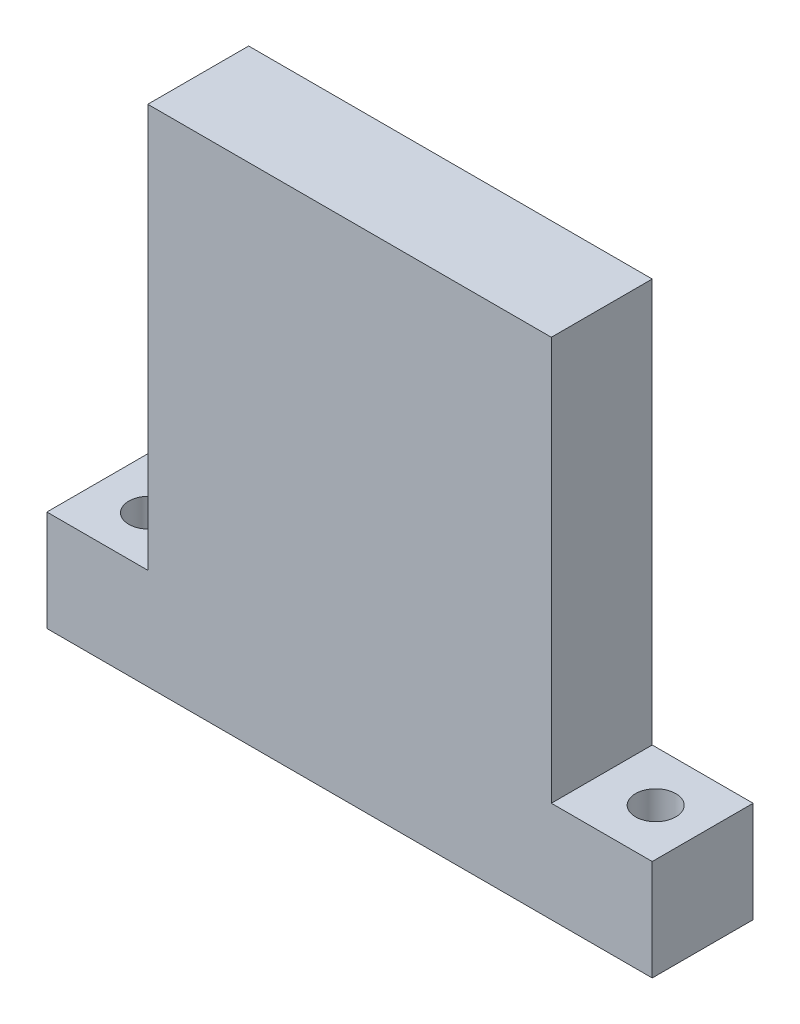
ISO-10303-21;
HEADER;
FILE_DESCRIPTION(('STEP AP214'),'2;1');
FILE_NAME('part.step','',(''),(''),'','','');
FILE_SCHEMA(('AUTOMOTIVE_DESIGN { 1 0 10303 214 1 1 1 1 }'));
ENDSEC;
DATA;
#1=APPLICATION_CONTEXT('core data for automotive mechanical design processes');
#2=APPLICATION_PROTOCOL_DEFINITION('international standard','automotive_design',2000,#1);
#3=PRODUCT_CONTEXT('',#1,'mechanical');
#4=PRODUCT('Part','Part','',(#3));
#5=PRODUCT_RELATED_PRODUCT_CATEGORY('part','',(#4));
#6=PRODUCT_DEFINITION_FORMATION('','',#4);
#7=PRODUCT_DEFINITION_CONTEXT('part definition',#1,'design');
#8=PRODUCT_DEFINITION('design','',#6,#7);
#9=PRODUCT_DEFINITION_SHAPE('','',#8);
#10=(LENGTH_UNIT() NAMED_UNIT(*) SI_UNIT(.MILLI.,.METRE.));
#11=(NAMED_UNIT(*) PLANE_ANGLE_UNIT() SI_UNIT($,.RADIAN.));
#12=(NAMED_UNIT(*) SI_UNIT($,.STERADIAN.) SOLID_ANGLE_UNIT());
#13=UNCERTAINTY_MEASURE_WITH_UNIT(LENGTH_MEASURE(1.E-05),#10,'distance_accuracy_value','');
#14=(GEOMETRIC_REPRESENTATION_CONTEXT(3) GLOBAL_UNCERTAINTY_ASSIGNED_CONTEXT((#13)) GLOBAL_UNIT_ASSIGNED_CONTEXT((#10,
#11,#12)) REPRESENTATION_CONTEXT('',''));
#15=CARTESIAN_POINT('',(0.,0.,0.));
#16=DIRECTION('',(0.,0.,1.));
#17=DIRECTION('',(1.,0.,0.));
#18=AXIS2_PLACEMENT_3D('',#15,#16,#17);
#19=CARTESIAN_POINT('',(0.,10.,0.));
#20=DIRECTION('',(0.,1.,0.));
#21=DIRECTION('',(0.,0.,1.));
#22=AXIS2_PLACEMENT_3D('',#19,#20,#21);
#23=PLANE('',#22);
#24=CARTESIAN_POINT('',(25.342956813367,10.,0.));
#25=DIRECTION('',(0.,1.,0.));
#26=DIRECTION('',(0.,0.,1.));
#27=AXIS2_PLACEMENT_3D('',#24,#25,#26);
#28=CIRCLE('',#27,2.);
#29=CARTESIAN_POINT('',(25.342956813367,9.99999999999999,2.));
#30=VERTEX_POINT('',#29);
#31=EDGE_CURVE('E169',#30,#30,#28,.T.);
#32=ORIENTED_EDGE('',*,*,#31,.F.);
#33=EDGE_LOOP('',(#32));
#34=FACE_BOUND('',#33,.T.);
#35=DIRECTION('',(0.,0.,-1.));
#36=VECTOR('',#35,1.);
#37=CARTESIAN_POINT('',(20.,10.,-5.));
#38=LINE('',#37,#36);
#39=CARTESIAN_POINT('',(20.,10.,5.));
#40=VERTEX_POINT('',#39);
#41=CARTESIAN_POINT('',(20.,10.,-5.));
#42=VERTEX_POINT('',#41);
#43=EDGE_CURVE('E52',#40,#42,#38,.T.);
#44=ORIENTED_EDGE('',*,*,#43,.F.);
#45=DIRECTION('',(1.,0.,0.));
#46=VECTOR('',#45,1.);
#47=CARTESIAN_POINT('',(-30.,10.,5.));
#48=LINE('',#47,#46);
#49=CARTESIAN_POINT('',(30.,10.,5.));
#50=VERTEX_POINT('',#49);
#51=EDGE_CURVE('E141',#40,#50,#48,.T.);
#52=ORIENTED_EDGE('',*,*,#51,.T.);
#53=DIRECTION('',(0.,0.,-1.));
#54=VECTOR('',#53,1.);
#55=CARTESIAN_POINT('',(30.,10.,-5.));
#56=LINE('',#55,#54);
#57=CARTESIAN_POINT('',(30.,10.,-5.));
#58=VERTEX_POINT('',#57);
#59=EDGE_CURVE('E132',#50,#58,#56,.T.);
#60=ORIENTED_EDGE('',*,*,#59,.T.);
#61=DIRECTION('',(-1.,0.,0.));
#62=VECTOR('',#61,1.);
#63=CARTESIAN_POINT('',(-30.,10.,-5.));
#64=LINE('',#63,#62);
#65=EDGE_CURVE('E137',#58,#42,#64,.T.);
#66=ORIENTED_EDGE('',*,*,#65,.T.);
#67=EDGE_LOOP('',(#44,#52,#60,#66));
#68=FACE_BOUND('',#67,.T.);
#69=ADVANCED_FACE('F35',(#34,#68),#23,.T.);
#70=CARTESIAN_POINT('',(30.,10.,-5.));
#71=DIRECTION('',(-1.,0.,0.));
#72=DIRECTION('',(0.,0.,1.));
#73=AXIS2_PLACEMENT_3D('',#70,#71,#72);
#74=PLANE('',#73);
#75=DIRECTION('',(0.,0.,-1.));
#76=VECTOR('',#75,1.);
#77=CARTESIAN_POINT('',(30.,0.,-5.));
#78=LINE('',#77,#76);
#79=CARTESIAN_POINT('',(30.,0.,5.));
#80=VERTEX_POINT('',#79);
#81=CARTESIAN_POINT('',(30.,0.,-5.));
#82=VERTEX_POINT('',#81);
#83=EDGE_CURVE('E123',#80,#82,#78,.T.);
#84=ORIENTED_EDGE('',*,*,#83,.T.);
#85=DIRECTION('',(0.,-1.,0.));
#86=VECTOR('',#85,1.);
#87=CARTESIAN_POINT('',(30.,10.,-5.));
#88=LINE('',#87,#86);
#89=EDGE_CURVE('E11',#58,#82,#88,.T.);
#90=ORIENTED_EDGE('',*,*,#89,.F.);
#91=ORIENTED_EDGE('',*,*,#59,.F.);
#92=DIRECTION('',(0.,-1.,0.));
#93=VECTOR('',#92,1.);
#94=CARTESIAN_POINT('',(30.,10.,5.));
#95=LINE('',#94,#93);
#96=EDGE_CURVE('E143',#50,#80,#95,.T.);
#97=ORIENTED_EDGE('',*,*,#96,.T.);
#98=EDGE_LOOP('',(#84,#90,#91,#97));
#99=FACE_BOUND('',#98,.T.);
#100=ADVANCED_FACE('F37',(#99),#74,.F.);
#101=CARTESIAN_POINT('',(-30.,10.,-5.));
#102=DIRECTION('',(0.,0.,1.));
#103=DIRECTION('',(1.,0.,0.));
#104=AXIS2_PLACEMENT_3D('',#101,#102,#103);
#105=PLANE('',#104);
#106=CARTESIAN_POINT('',(0.,30.,-5.));
#107=DIRECTION('',(0.,0.,-1.));
#108=DIRECTION('',(-1.,0.,0.));
#109=AXIS2_PLACEMENT_3D('',#106,#107,#108);
#110=CIRCLE('',#109,11.);
#111=CARTESIAN_POINT('',(-11.,30.,-5.));
#112=VERTEX_POINT('',#111);
#113=EDGE_CURVE('E157',#112,#112,#110,.T.);
#114=ORIENTED_EDGE('',*,*,#113,.F.);
#115=EDGE_LOOP('',(#114));
#116=FACE_BOUND('',#115,.T.);
#117=DIRECTION('',(-1.,0.,0.));
#118=VECTOR('',#117,1.);
#119=CARTESIAN_POINT('',(-30.,0.,-5.));
#120=LINE('',#119,#118);
#121=CARTESIAN_POINT('',(-30.,0.,-5.));
#122=VERTEX_POINT('',#121);
#123=EDGE_CURVE('E126',#82,#122,#120,.T.);
#124=ORIENTED_EDGE('',*,*,#123,.T.);
#125=DIRECTION('',(0.,-1.,0.));
#126=VECTOR('',#125,1.);
#127=CARTESIAN_POINT('',(-30.,10.,-5.));
#128=LINE('',#127,#126);
#129=CARTESIAN_POINT('',(-30.,10.,-5.));
#130=VERTEX_POINT('',#129);
#131=EDGE_CURVE('E44',#130,#122,#128,.T.);
#132=ORIENTED_EDGE('',*,*,#131,.F.);
#133=CARTESIAN_POINT('',(-20.,10.,-5.));
#134=VERTEX_POINT('',#133);
#135=EDGE_CURVE('E135',#134,#130,#64,.T.);
#136=ORIENTED_EDGE('',*,*,#135,.F.);
#137=DIRECTION('',(0.,-1.,0.));
#138=VECTOR('',#137,1.);
#139=CARTESIAN_POINT('',(-20.,50.,-5.));
#140=LINE('',#139,#138);
#141=CARTESIAN_POINT('',(-20.,50.,-5.));
#142=VERTEX_POINT('',#141);
#143=EDGE_CURVE('E108',#142,#134,#140,.T.);
#144=ORIENTED_EDGE('',*,*,#143,.F.);
#145=DIRECTION('',(-1.,0.,0.));
#146=VECTOR('',#145,1.);
#147=CARTESIAN_POINT('',(-20.,50.,-5.));
#148=LINE('',#147,#146);
#149=CARTESIAN_POINT('',(20.,50.,-5.));
#150=VERTEX_POINT('',#149);
#151=EDGE_CURVE('E102',#150,#142,#148,.T.);
#152=ORIENTED_EDGE('',*,*,#151,.F.);
#153=DIRECTION('',(0.,-1.,0.));
#154=VECTOR('',#153,1.);
#155=CARTESIAN_POINT('',(20.,50.,-5.));
#156=LINE('',#155,#154);
#157=EDGE_CURVE('E106',#150,#42,#156,.T.);
#158=ORIENTED_EDGE('',*,*,#157,.T.);
#159=ORIENTED_EDGE('',*,*,#65,.F.);
#160=ORIENTED_EDGE('',*,*,#89,.T.);
#161=EDGE_LOOP('',(#124,#132,#136,#144,#152,#158,#159,#160));
#162=FACE_BOUND('',#161,.T.);
#163=ADVANCED_FACE('F104',(#116,#162),#105,.F.);
#164=CARTESIAN_POINT('',(-30.,10.,-5.));
#165=DIRECTION('',(1.,0.,0.));
#166=DIRECTION('',(0.,0.,-1.));
#167=AXIS2_PLACEMENT_3D('',#164,#165,#166);
#168=PLANE('',#167);
#169=DIRECTION('',(0.,0.,1.));
#170=VECTOR('',#169,1.);
#171=CARTESIAN_POINT('',(-30.,0.,-5.));
#172=LINE('',#171,#170);
#173=CARTESIAN_POINT('',(-30.,0.,5.));
#174=VERTEX_POINT('',#173);
#175=EDGE_CURVE('E146',#122,#174,#172,.T.);
#176=ORIENTED_EDGE('',*,*,#175,.T.);
#177=DIRECTION('',(0.,-1.,0.));
#178=VECTOR('',#177,1.);
#179=CARTESIAN_POINT('',(-30.,10.,5.));
#180=LINE('',#179,#178);
#181=CARTESIAN_POINT('',(-30.,10.,5.));
#182=VERTEX_POINT('',#181);
#183=EDGE_CURVE('E151',#182,#174,#180,.T.);
#184=ORIENTED_EDGE('',*,*,#183,.F.);
#185=DIRECTION('',(0.,0.,1.));
#186=VECTOR('',#185,1.);
#187=CARTESIAN_POINT('',(-30.,10.,-5.));
#188=LINE('',#187,#186);
#189=EDGE_CURVE('E139',#130,#182,#188,.T.);
#190=ORIENTED_EDGE('',*,*,#189,.F.);
#191=ORIENTED_EDGE('',*,*,#131,.T.);
#192=EDGE_LOOP('',(#176,#184,#190,#191));
#193=FACE_BOUND('',#192,.T.);
#194=ADVANCED_FACE('F213',(#193),#168,.F.);
#195=CARTESIAN_POINT('',(-30.,10.,5.));
#196=DIRECTION('',(0.,0.,-1.));
#197=DIRECTION('',(-1.,0.,0.));
#198=AXIS2_PLACEMENT_3D('',#195,#196,#197);
#199=PLANE('',#198);
#200=DIRECTION('',(1.,0.,0.));
#201=VECTOR('',#200,1.);
#202=CARTESIAN_POINT('',(-30.,0.,5.));
#203=LINE('',#202,#201);
#204=EDGE_CURVE('E136',#174,#80,#203,.T.);
#205=ORIENTED_EDGE('',*,*,#204,.T.);
#206=ORIENTED_EDGE('',*,*,#96,.F.);
#207=ORIENTED_EDGE('',*,*,#51,.F.);
#208=DIRECTION('',(0.,-1.,0.));
#209=VECTOR('',#208,1.);
#210=CARTESIAN_POINT('',(20.,50.,5.));
#211=LINE('',#210,#209);
#212=CARTESIAN_POINT('',(20.,50.,5.));
#213=VERTEX_POINT('',#212);
#214=EDGE_CURVE('E176',#213,#40,#211,.T.);
#215=ORIENTED_EDGE('',*,*,#214,.F.);
#216=DIRECTION('',(1.,0.,0.));
#217=VECTOR('',#216,1.);
#218=CARTESIAN_POINT('',(-20.,50.,5.));
#219=LINE('',#218,#217);
#220=CARTESIAN_POINT('',(-20.,50.,5.));
#221=VERTEX_POINT('',#220);
#222=EDGE_CURVE('E117',#221,#213,#219,.T.);
#223=ORIENTED_EDGE('',*,*,#222,.F.);
#224=DIRECTION('',(0.,-1.,0.));
#225=VECTOR('',#224,1.);
#226=CARTESIAN_POINT('',(-20.,50.,5.));
#227=LINE('',#226,#225);
#228=CARTESIAN_POINT('',(-20.,10.,5.));
#229=VERTEX_POINT('',#228);
#230=EDGE_CURVE('E128',#221,#229,#227,.T.);
#231=ORIENTED_EDGE('',*,*,#230,.T.);
#232=EDGE_CURVE('E142',#182,#229,#48,.T.);
#233=ORIENTED_EDGE('',*,*,#232,.F.);
#234=ORIENTED_EDGE('',*,*,#183,.T.);
#235=EDGE_LOOP('',(#205,#206,#207,#215,#223,#231,#233,#234));
#236=FACE_BOUND('',#235,.T.);
#237=ADVANCED_FACE('F183',(#236),#199,.F.);
#238=CARTESIAN_POINT('',(-24.8796636726594,10.,0.));
#239=DIRECTION('',(0.,1.,0.));
#240=DIRECTION('',(0.,0.,1.));
#241=AXIS2_PLACEMENT_3D('',#238,#239,#240);
#242=CIRCLE('',#241,2.);
#243=CARTESIAN_POINT('',(-24.8796636726594,9.99999999999999,2.));
#244=VERTEX_POINT('',#243);
#245=EDGE_CURVE('E158',#244,#244,#242,.T.);
#246=ORIENTED_EDGE('',*,*,#245,.F.);
#247=EDGE_LOOP('',(#246));
#248=FACE_BOUND('',#247,.T.);
#249=DIRECTION('',(0.,0.,1.));
#250=VECTOR('',#249,1.);
#251=CARTESIAN_POINT('',(-20.,10.,-5.));
#252=LINE('',#251,#250);
#253=EDGE_CURVE('E60',#134,#229,#252,.T.);
#254=ORIENTED_EDGE('',*,*,#253,.F.);
#255=ORIENTED_EDGE('',*,*,#135,.T.);
#256=ORIENTED_EDGE('',*,*,#189,.T.);
#257=ORIENTED_EDGE('',*,*,#232,.T.);
#258=EDGE_LOOP('',(#254,#255,#256,#257));
#259=FACE_BOUND('',#258,.T.);
#260=ADVANCED_FACE('F199',(#248,#259),#23,.T.);
#261=CARTESIAN_POINT('',(0.,0.,0.));
#262=DIRECTION('',(0.,1.,0.));
#263=DIRECTION('',(0.,0.,1.));
#264=AXIS2_PLACEMENT_3D('',#261,#262,#263);
#265=PLANE('',#264);
#266=CARTESIAN_POINT('',(25.342956813367,0.,0.));
#267=DIRECTION('',(0.,1.,0.));
#268=DIRECTION('',(0.,0.,1.));
#269=AXIS2_PLACEMENT_3D('',#266,#267,#268);
#270=CIRCLE('',#269,2.);
#271=CARTESIAN_POINT('',(25.342956813367,0.,2.));
#272=VERTEX_POINT('',#271);
#273=EDGE_CURVE('E39',#272,#272,#270,.T.);
#274=ORIENTED_EDGE('',*,*,#273,.T.);
#275=EDGE_LOOP('',(#274));
#276=FACE_BOUND('',#275,.T.);
#277=CARTESIAN_POINT('',(-24.8796636726594,0.,0.));
#278=DIRECTION('',(0.,1.,0.));
#279=DIRECTION('',(0.,0.,1.));
#280=AXIS2_PLACEMENT_3D('',#277,#278,#279);
#281=CIRCLE('',#280,2.);
#282=CARTESIAN_POINT('',(-24.8796636726594,0.,2.));
#283=VERTEX_POINT('',#282);
#284=EDGE_CURVE('E155',#283,#283,#281,.T.);
#285=ORIENTED_EDGE('',*,*,#284,.T.);
#286=EDGE_LOOP('',(#285));
#287=FACE_BOUND('',#286,.T.);
#288=ORIENTED_EDGE('',*,*,#83,.F.);
#289=ORIENTED_EDGE('',*,*,#204,.F.);
#290=ORIENTED_EDGE('',*,*,#175,.F.);
#291=ORIENTED_EDGE('',*,*,#123,.F.);
#292=EDGE_LOOP('',(#288,#289,#290,#291));
#293=FACE_BOUND('',#292,.T.);
#294=ADVANCED_FACE('F194',(#276,#287,#293),#265,.F.);
#295=CARTESIAN_POINT('',(20.,50.,-5.));
#296=DIRECTION('',(-1.,0.,0.));
#297=DIRECTION('',(0.,0.,1.));
#298=AXIS2_PLACEMENT_3D('',#295,#296,#297);
#299=PLANE('',#298);
#300=ORIENTED_EDGE('',*,*,#43,.T.);
#301=ORIENTED_EDGE('',*,*,#157,.F.);
#302=DIRECTION('',(0.,0.,-1.));
#303=VECTOR('',#302,1.);
#304=CARTESIAN_POINT('',(20.,50.,-5.));
#305=LINE('',#304,#303);
#306=EDGE_CURVE('E112',#213,#150,#305,.T.);
#307=ORIENTED_EDGE('',*,*,#306,.F.);
#308=ORIENTED_EDGE('',*,*,#214,.T.);
#309=EDGE_LOOP('',(#300,#301,#307,#308));
#310=FACE_BOUND('',#309,.T.);
#311=ADVANCED_FACE('F122',(#310),#299,.F.);
#312=CARTESIAN_POINT('',(-20.,50.,-5.));
#313=DIRECTION('',(1.,0.,0.));
#314=DIRECTION('',(0.,0.,-1.));
#315=AXIS2_PLACEMENT_3D('',#312,#313,#314);
#316=PLANE('',#315);
#317=ORIENTED_EDGE('',*,*,#253,.T.);
#318=ORIENTED_EDGE('',*,*,#230,.F.);
#319=DIRECTION('',(0.,0.,1.));
#320=VECTOR('',#319,1.);
#321=CARTESIAN_POINT('',(-20.,50.,-5.));
#322=LINE('',#321,#320);
#323=EDGE_CURVE('E111',#142,#221,#322,.T.);
#324=ORIENTED_EDGE('',*,*,#323,.F.);
#325=ORIENTED_EDGE('',*,*,#143,.T.);
#326=EDGE_LOOP('',(#317,#318,#324,#325));
#327=FACE_BOUND('',#326,.T.);
#328=ADVANCED_FACE('F185',(#327),#316,.F.);
#329=CARTESIAN_POINT('',(0.,50.,0.));
#330=DIRECTION('',(0.,1.,0.));
#331=DIRECTION('',(0.,0.,1.));
#332=AXIS2_PLACEMENT_3D('',#329,#330,#331);
#333=PLANE('',#332);
#334=ORIENTED_EDGE('',*,*,#306,.T.);
#335=ORIENTED_EDGE('',*,*,#151,.T.);
#336=ORIENTED_EDGE('',*,*,#323,.T.);
#337=ORIENTED_EDGE('',*,*,#222,.T.);
#338=EDGE_LOOP('',(#334,#335,#336,#337));
#339=FACE_BOUND('',#338,.T.);
#340=ADVANCED_FACE('F115',(#339),#333,.T.);
#341=CARTESIAN_POINT('',(0.,30.,2.99999999999998));
#342=DIRECTION('',(0.,0.,-1.));
#343=DIRECTION('',(-1.,0.,0.));
#344=AXIS2_PLACEMENT_3D('',#341,#342,#343);
#345=CYLINDRICAL_SURFACE('',#344,11.);
#346=CARTESIAN_POINT('',(0.,30.,2.99999999999998));
#347=DIRECTION('',(0.,0.,-1.));
#348=DIRECTION('',(-1.,0.,0.));
#349=AXIS2_PLACEMENT_3D('',#346,#347,#348);
#350=CIRCLE('',#349,11.);
#351=CARTESIAN_POINT('',(-11.,30.,2.99999999999998));
#352=VERTEX_POINT('',#351);
#353=EDGE_CURVE('E162',#352,#352,#350,.T.);
#354=ORIENTED_EDGE('',*,*,#353,.F.);
#355=EDGE_LOOP('',(#354));
#356=FACE_BOUND('',#355,.T.);
#357=ORIENTED_EDGE('',*,*,#113,.T.);
#358=EDGE_LOOP('',(#357));
#359=FACE_BOUND('',#358,.T.);
#360=ADVANCED_FACE('F192',(#356,#359),#345,.F.);
#361=CARTESIAN_POINT('',(0.,30.,2.99999999999998));
#362=DIRECTION('',(0.,0.,-1.));
#363=DIRECTION('',(-1.,0.,0.));
#364=AXIS2_PLACEMENT_3D('',#361,#362,#363);
#365=PLANE('',#364);
#366=ORIENTED_EDGE('',*,*,#353,.T.);
#367=EDGE_LOOP('',(#366));
#368=FACE_BOUND('',#367,.T.);
#369=ADVANCED_FACE('F227',(#368),#365,.T.);
#370=CARTESIAN_POINT('',(-24.8796636726594,-35.,0.));
#371=DIRECTION('',(0.,1.,0.));
#372=DIRECTION('',(0.,0.,1.));
#373=AXIS2_PLACEMENT_3D('',#370,#371,#372);
#374=CYLINDRICAL_SURFACE('',#373,2.);
#375=CARTESIAN_POINT('',(-24.8796636726594,9.99999999999999,2.));
#376=CARTESIAN_POINT('',(-24.8796636726594,9.89583333333333,2.));
#377=CARTESIAN_POINT('',(-24.8796636726594,9.79166666666666,2.));
#378=CARTESIAN_POINT('',(-24.8796636726594,9.58333333333333,2.));
#379=CARTESIAN_POINT('',(-24.8796636726594,9.47916666666666,2.));
#380=CARTESIAN_POINT('',(-24.8796636726594,9.27083333333333,2.));
#381=CARTESIAN_POINT('',(-24.8796636726594,9.16666666666666,2.));
#382=CARTESIAN_POINT('',(-24.8796636726594,8.95833333333333,2.));
#383=CARTESIAN_POINT('',(-24.8796636726594,8.85416666666666,2.));
#384=CARTESIAN_POINT('',(-24.8796636726594,8.64583333333333,2.));
#385=CARTESIAN_POINT('',(-24.8796636726594,8.54166666666666,2.));
#386=CARTESIAN_POINT('',(-24.8796636726594,8.33333333333333,2.));
#387=CARTESIAN_POINT('',(-24.8796636726594,8.22916666666666,2.));
#388=CARTESIAN_POINT('',(-24.8796636726594,8.02083333333333,2.));
#389=CARTESIAN_POINT('',(-24.8796636726594,7.91666666666666,2.));
#390=CARTESIAN_POINT('',(-24.8796636726594,7.70833333333333,2.));
#391=CARTESIAN_POINT('',(-24.8796636726594,7.60416666666666,2.));
#392=CARTESIAN_POINT('',(-24.8796636726594,7.39583333333333,2.));
#393=CARTESIAN_POINT('',(-24.8796636726594,7.29166666666666,2.));
#394=CARTESIAN_POINT('',(-24.8796636726594,7.08333333333333,2.));
#395=CARTESIAN_POINT('',(-24.8796636726594,6.97916666666667,2.));
#396=CARTESIAN_POINT('',(-24.8796636726594,6.77083333333333,2.));
#397=CARTESIAN_POINT('',(-24.8796636726594,6.66666666666667,2.));
#398=CARTESIAN_POINT('',(-24.8796636726594,6.45833333333333,2.));
#399=CARTESIAN_POINT('',(-24.8796636726594,6.35416666666667,2.));
#400=CARTESIAN_POINT('',(-24.8796636726594,6.14583333333333,2.));
#401=CARTESIAN_POINT('',(-24.8796636726594,6.04166666666667,2.));
#402=CARTESIAN_POINT('',(-24.8796636726594,5.83333333333333,2.));
#403=CARTESIAN_POINT('',(-24.8796636726594,5.72916666666666,2.));
#404=CARTESIAN_POINT('',(-24.8796636726594,5.52083333333333,2.));
#405=CARTESIAN_POINT('',(-24.8796636726594,5.41666666666666,2.));
#406=CARTESIAN_POINT('',(-24.8796636726594,5.20833333333333,2.));
#407=CARTESIAN_POINT('',(-24.8796636726594,5.10416666666666,2.));
#408=CARTESIAN_POINT('',(-24.8796636726594,4.89583333333333,2.));
#409=CARTESIAN_POINT('',(-24.8796636726594,4.79166666666666,2.));
#410=CARTESIAN_POINT('',(-24.8796636726594,4.58333333333333,2.));
#411=CARTESIAN_POINT('',(-24.8796636726594,4.47916666666666,2.));
#412=CARTESIAN_POINT('',(-24.8796636726594,4.27083333333333,2.));
#413=CARTESIAN_POINT('',(-24.8796636726594,4.16666666666666,2.));
#414=CARTESIAN_POINT('',(-24.8796636726594,3.95833333333333,2.));
#415=CARTESIAN_POINT('',(-24.8796636726594,3.85416666666666,2.));
#416=CARTESIAN_POINT('',(-24.8796636726594,3.64583333333333,2.));
#417=CARTESIAN_POINT('',(-24.8796636726594,3.54166666666666,2.));
#418=CARTESIAN_POINT('',(-24.8796636726594,3.33333333333333,2.));
#419=CARTESIAN_POINT('',(-24.8796636726594,3.22916666666666,2.));
#420=CARTESIAN_POINT('',(-24.8796636726594,3.02083333333333,2.));
#421=CARTESIAN_POINT('',(-24.8796636726594,2.91666666666666,2.));
#422=CARTESIAN_POINT('',(-24.8796636726594,2.70833333333333,2.));
#423=CARTESIAN_POINT('',(-24.8796636726594,2.60416666666667,2.));
#424=CARTESIAN_POINT('',(-24.8796636726594,2.39583333333333,2.));
#425=CARTESIAN_POINT('',(-24.8796636726594,2.29166666666666,2.));
#426=CARTESIAN_POINT('',(-24.8796636726594,2.08333333333333,2.));
#427=CARTESIAN_POINT('',(-24.8796636726594,1.97916666666667,2.));
#428=CARTESIAN_POINT('',(-24.8796636726594,1.77083333333334,2.));
#429=CARTESIAN_POINT('',(-24.8796636726594,1.66666666666667,2.));
#430=CARTESIAN_POINT('',(-24.8796636726594,1.45833333333333,2.));
#431=CARTESIAN_POINT('',(-24.8796636726594,1.35416666666667,2.));
#432=CARTESIAN_POINT('',(-24.8796636726594,1.14583333333333,2.));
#433=CARTESIAN_POINT('',(-24.8796636726594,1.04166666666667,2.));
#434=CARTESIAN_POINT('',(-24.8796636726594,0.833333333333334,2.));
#435=CARTESIAN_POINT('',(-24.8796636726594,0.729166666666667,2.));
#436=CARTESIAN_POINT('',(-24.8796636726594,0.520833333333334,2.));
#437=CARTESIAN_POINT('',(-24.8796636726594,0.416666666666667,2.));
#438=CARTESIAN_POINT('',(-24.8796636726594,0.208333333333334,2.));
#439=CARTESIAN_POINT('',(-24.8796636726594,0.104166666666667,2.));
#440=CARTESIAN_POINT('',(-24.8796636726594,0.,2.));
#441=B_SPLINE_CURVE_WITH_KNOTS('',3,(#375,#376,#377,#378,#379,#380,#381,#382,#383,#384,#385,
#386,#387,#388,#389,#390,#391,#392,#393,#394,#395,#396,#397,#398,#399,#400,#401,#402,#403,#404,
#405,#406,#407,#408,#409,#410,#411,#412,#413,#414,#415,#416,#417,#418,#419,#420,#421,#422,#423,
#424,#425,#426,#427,#428,#429,#430,#431,#432,#433,#434,#435,#436,#437,#438,#439,#440),
.UNSPECIFIED.,.F.,.F.,(4,2,2,2,2,2,2,2,2,2,2,2,2,2,2,2,2,2,2,2,2,2,2,2,2,2,2,2,2,2,2,2,4),(0.,
0.3125,0.625000000000001,0.937500000000001,1.25,1.5625,1.875,2.1875,2.5,2.8125,3.125,3.4375,
3.75,4.0625,4.375,4.6875,5.,5.3125,5.625,5.9375,6.25,6.5625,6.875,7.1875,7.49999999999999,
7.8125,8.12499999999999,8.43749999999999,8.74999999999999,9.06249999999999,9.37499999999999,
9.68749999999999,9.99999999999999),.UNSPECIFIED.);
#442=EDGE_CURVE('BSEAM233',#244,#283,#441,.T.);
#443=ORIENTED_EDGE('',*,*,#245,.T.);
#444=ORIENTED_EDGE('',*,*,#284,.F.);
#445=ORIENTED_EDGE('',*,*,#442,.T.);
#446=ORIENTED_EDGE('',*,*,#442,.F.);
#447=EDGE_LOOP('',(#443,#445,#444,#446));
#448=FACE_BOUND('',#447,.T.);
#449=ADVANCED_FACE('F233',(#448),#374,.F.);
#450=CARTESIAN_POINT('',(25.342956813367,-35.,0.));
#451=DIRECTION('',(0.,1.,0.));
#452=DIRECTION('',(0.,0.,1.));
#453=AXIS2_PLACEMENT_3D('',#450,#451,#452);
#454=CYLINDRICAL_SURFACE('',#453,2.);
#455=CARTESIAN_POINT('',(25.342956813367,9.99999999999999,2.));
#456=CARTESIAN_POINT('',(25.342956813367,9.89583333333333,2.));
#457=CARTESIAN_POINT('',(25.342956813367,9.79166666666666,2.));
#458=CARTESIAN_POINT('',(25.342956813367,9.58333333333333,2.));
#459=CARTESIAN_POINT('',(25.342956813367,9.47916666666666,2.));
#460=CARTESIAN_POINT('',(25.342956813367,9.27083333333333,2.));
#461=CARTESIAN_POINT('',(25.342956813367,9.16666666666666,2.));
#462=CARTESIAN_POINT('',(25.342956813367,8.95833333333333,2.));
#463=CARTESIAN_POINT('',(25.342956813367,8.85416666666666,2.));
#464=CARTESIAN_POINT('',(25.342956813367,8.64583333333333,2.));
#465=CARTESIAN_POINT('',(25.342956813367,8.54166666666666,2.));
#466=CARTESIAN_POINT('',(25.342956813367,8.33333333333333,2.));
#467=CARTESIAN_POINT('',(25.342956813367,8.22916666666666,2.));
#468=CARTESIAN_POINT('',(25.342956813367,8.02083333333333,2.));
#469=CARTESIAN_POINT('',(25.342956813367,7.91666666666666,2.));
#470=CARTESIAN_POINT('',(25.342956813367,7.70833333333333,2.));
#471=CARTESIAN_POINT('',(25.342956813367,7.60416666666666,2.));
#472=CARTESIAN_POINT('',(25.342956813367,7.39583333333333,2.));
#473=CARTESIAN_POINT('',(25.342956813367,7.29166666666666,2.));
#474=CARTESIAN_POINT('',(25.342956813367,7.08333333333333,2.));
#475=CARTESIAN_POINT('',(25.342956813367,6.97916666666667,2.));
#476=CARTESIAN_POINT('',(25.342956813367,6.77083333333333,2.));
#477=CARTESIAN_POINT('',(25.342956813367,6.66666666666667,2.));
#478=CARTESIAN_POINT('',(25.342956813367,6.45833333333333,2.));
#479=CARTESIAN_POINT('',(25.342956813367,6.35416666666667,2.));
#480=CARTESIAN_POINT('',(25.342956813367,6.14583333333333,2.));
#481=CARTESIAN_POINT('',(25.342956813367,6.04166666666667,2.));
#482=CARTESIAN_POINT('',(25.342956813367,5.83333333333333,2.));
#483=CARTESIAN_POINT('',(25.342956813367,5.72916666666666,2.));
#484=CARTESIAN_POINT('',(25.342956813367,5.52083333333333,2.));
#485=CARTESIAN_POINT('',(25.342956813367,5.41666666666666,2.));
#486=CARTESIAN_POINT('',(25.342956813367,5.20833333333333,2.));
#487=CARTESIAN_POINT('',(25.342956813367,5.10416666666666,2.));
#488=CARTESIAN_POINT('',(25.342956813367,4.89583333333333,2.));
#489=CARTESIAN_POINT('',(25.342956813367,4.79166666666666,2.));
#490=CARTESIAN_POINT('',(25.342956813367,4.58333333333333,2.));
#491=CARTESIAN_POINT('',(25.342956813367,4.47916666666666,2.));
#492=CARTESIAN_POINT('',(25.342956813367,4.27083333333333,2.));
#493=CARTESIAN_POINT('',(25.342956813367,4.16666666666666,2.));
#494=CARTESIAN_POINT('',(25.342956813367,3.95833333333333,2.));
#495=CARTESIAN_POINT('',(25.342956813367,3.85416666666666,2.));
#496=CARTESIAN_POINT('',(25.342956813367,3.64583333333333,2.));
#497=CARTESIAN_POINT('',(25.342956813367,3.54166666666666,2.));
#498=CARTESIAN_POINT('',(25.342956813367,3.33333333333333,2.));
#499=CARTESIAN_POINT('',(25.342956813367,3.22916666666666,2.));
#500=CARTESIAN_POINT('',(25.342956813367,3.02083333333333,2.));
#501=CARTESIAN_POINT('',(25.342956813367,2.91666666666666,2.));
#502=CARTESIAN_POINT('',(25.342956813367,2.70833333333333,2.));
#503=CARTESIAN_POINT('',(25.342956813367,2.60416666666667,2.));
#504=CARTESIAN_POINT('',(25.342956813367,2.39583333333333,2.));
#505=CARTESIAN_POINT('',(25.342956813367,2.29166666666666,2.));
#506=CARTESIAN_POINT('',(25.342956813367,2.08333333333333,2.));
#507=CARTESIAN_POINT('',(25.342956813367,1.97916666666667,2.));
#508=CARTESIAN_POINT('',(25.342956813367,1.77083333333334,2.));
#509=CARTESIAN_POINT('',(25.342956813367,1.66666666666667,2.));
#510=CARTESIAN_POINT('',(25.342956813367,1.45833333333333,2.));
#511=CARTESIAN_POINT('',(25.342956813367,1.35416666666667,2.));
#512=CARTESIAN_POINT('',(25.342956813367,1.14583333333333,2.));
#513=CARTESIAN_POINT('',(25.342956813367,1.04166666666667,2.));
#514=CARTESIAN_POINT('',(25.342956813367,0.833333333333334,2.));
#515=CARTESIAN_POINT('',(25.342956813367,0.729166666666667,2.));
#516=CARTESIAN_POINT('',(25.342956813367,0.520833333333334,2.));
#517=CARTESIAN_POINT('',(25.342956813367,0.416666666666667,2.));
#518=CARTESIAN_POINT('',(25.342956813367,0.208333333333334,2.));
#519=CARTESIAN_POINT('',(25.342956813367,0.104166666666667,2.));
#520=CARTESIAN_POINT('',(25.342956813367,0.,2.));
#521=B_SPLINE_CURVE_WITH_KNOTS('',3,(#455,#456,#457,#458,#459,#460,#461,#462,#463,#464,#465,
#466,#467,#468,#469,#470,#471,#472,#473,#474,#475,#476,#477,#478,#479,#480,#481,#482,#483,#484,
#485,#486,#487,#488,#489,#490,#491,#492,#493,#494,#495,#496,#497,#498,#499,#500,#501,#502,#503,
#504,#505,#506,#507,#508,#509,#510,#511,#512,#513,#514,#515,#516,#517,#518,#519,#520),
.UNSPECIFIED.,.F.,.F.,(4,2,2,2,2,2,2,2,2,2,2,2,2,2,2,2,2,2,2,2,2,2,2,2,2,2,2,2,2,2,2,2,4),(0.,
0.3125,0.625000000000001,0.937500000000001,1.25,1.5625,1.875,2.1875,2.5,2.8125,3.125,3.4375,
3.75,4.0625,4.375,4.6875,5.,5.3125,5.625,5.9375,6.25,6.5625,6.875,7.1875,7.49999999999999,
7.8125,8.12499999999999,8.43749999999999,8.74999999999999,9.06249999999999,9.37499999999999,
9.68749999999999,9.99999999999999),.UNSPECIFIED.);
#522=EDGE_CURVE('BSEAM240',#30,#272,#521,.T.);
#523=ORIENTED_EDGE('',*,*,#31,.T.);
#524=ORIENTED_EDGE('',*,*,#273,.F.);
#525=ORIENTED_EDGE('',*,*,#522,.T.);
#526=ORIENTED_EDGE('',*,*,#522,.F.);
#527=EDGE_LOOP('',(#523,#525,#524,#526));
#528=FACE_BOUND('',#527,.T.);
#529=ADVANCED_FACE('F240',(#528),#454,.F.);
#530=CLOSED_SHELL('',(#69,#100,#163,#194,#237,#260,#294,#311,#328,#340,#360,#369,#449,#529));
#531=MANIFOLD_SOLID_BREP('B2',#530);
#532=ADVANCED_BREP_SHAPE_REPRESENTATION('',(#18,#531),#14);
#533=SHAPE_DEFINITION_REPRESENTATION(#9,#532);
ENDSEC;
END-ISO-10303-21;
